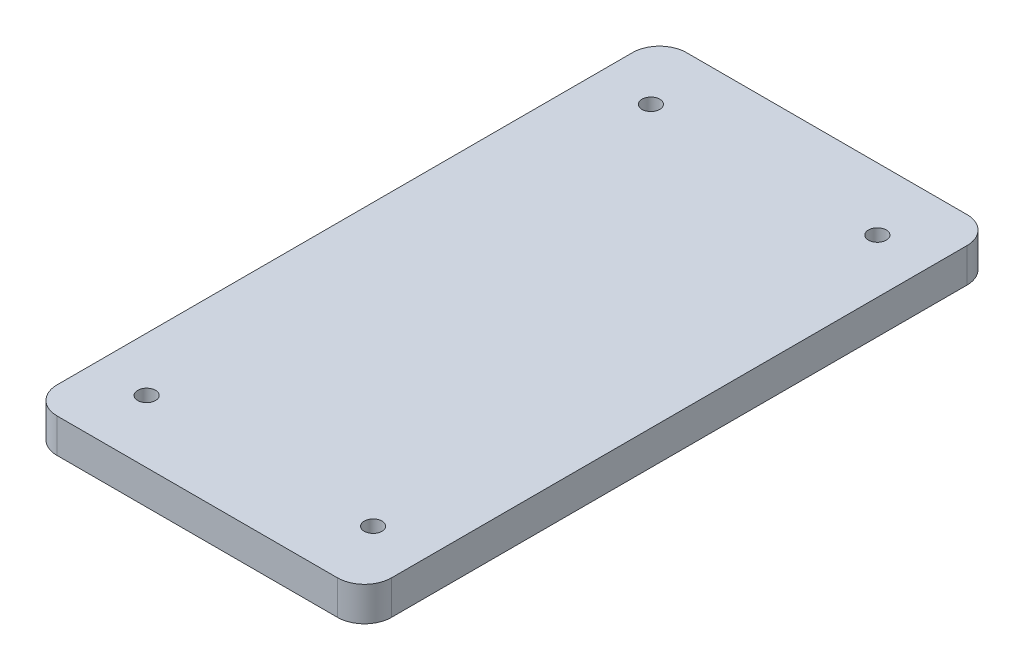
ISO-10303-21;
HEADER;
FILE_DESCRIPTION(('STEP AP214'),'2;1');
FILE_NAME('part.step','',(''),(''),'','','');
FILE_SCHEMA(('AUTOMOTIVE_DESIGN { 1 0 10303 214 1 1 1 1 }'));
ENDSEC;
DATA;
#1=APPLICATION_CONTEXT('core data for automotive mechanical design processes');
#2=APPLICATION_PROTOCOL_DEFINITION('international standard','automotive_design',2000,#1);
#3=PRODUCT_CONTEXT('',#1,'mechanical');
#4=PRODUCT('Part','Part','',(#3));
#5=PRODUCT_RELATED_PRODUCT_CATEGORY('part','',(#4));
#6=PRODUCT_DEFINITION_FORMATION('','',#4);
#7=PRODUCT_DEFINITION_CONTEXT('part definition',#1,'design');
#8=PRODUCT_DEFINITION('design','',#6,#7);
#9=PRODUCT_DEFINITION_SHAPE('','',#8);
#10=(LENGTH_UNIT() NAMED_UNIT(*) SI_UNIT(.MILLI.,.METRE.));
#11=(NAMED_UNIT(*) PLANE_ANGLE_UNIT() SI_UNIT($,.RADIAN.));
#12=(NAMED_UNIT(*) SI_UNIT($,.STERADIAN.) SOLID_ANGLE_UNIT());
#13=UNCERTAINTY_MEASURE_WITH_UNIT(LENGTH_MEASURE(1.E-05),#10,'distance_accuracy_value','');
#14=(GEOMETRIC_REPRESENTATION_CONTEXT(3) GLOBAL_UNCERTAINTY_ASSIGNED_CONTEXT((#13)) GLOBAL_UNIT_ASSIGNED_CONTEXT((#10,
#11,#12)) REPRESENTATION_CONTEXT('',''));
#15=CARTESIAN_POINT('',(0.,0.,0.));
#16=DIRECTION('',(0.,0.,1.));
#17=DIRECTION('',(1.,0.,0.));
#18=AXIS2_PLACEMENT_3D('',#15,#16,#17);
#19=CARTESIAN_POINT('',(0.,6.35,0.));
#20=DIRECTION('',(0.,-1.,0.));
#21=DIRECTION('',(0.,0.,-1.));
#22=AXIS2_PLACEMENT_3D('',#19,#20,#21);
#23=PLANE('',#22);
#24=DIRECTION('',(-1.,0.,0.));
#25=VECTOR('',#24,1.);
#26=CARTESIAN_POINT('',(0.,6.35,-116.7));
#27=LINE('',#26,#25);
#28=CARTESIAN_POINT('',(57.,6.35,-116.7));
#29=VERTEX_POINT('',#28);
#30=CARTESIAN_POINT('',(5.,6.35,-116.7));
#31=VERTEX_POINT('',#30);
#32=EDGE_CURVE('E154',#29,#31,#27,.T.);
#33=ORIENTED_EDGE('',*,*,#32,.T.);
#34=CARTESIAN_POINT('',(5.,6.35,-111.7));
#35=DIRECTION('',(0.,-1.,0.));
#36=DIRECTION('',(0.,0.,-1.));
#37=AXIS2_PLACEMENT_3D('',#34,#35,#36);
#38=CIRCLE('',#37,5.);
#39=CARTESIAN_POINT('',(0.,6.35,-111.7));
#40=VERTEX_POINT('',#39);
#41=EDGE_CURVE('E184',#31,#40,#38,.F.);
#42=ORIENTED_EDGE('',*,*,#41,.T.);
#43=DIRECTION('',(0.,0.,1.));
#44=VECTOR('',#43,1.);
#45=CARTESIAN_POINT('',(0.,6.35,0.));
#46=LINE('',#45,#44);
#47=CARTESIAN_POINT('',(0.,6.35,-5.));
#48=VERTEX_POINT('',#47);
#49=EDGE_CURVE('E133',#40,#48,#46,.T.);
#50=ORIENTED_EDGE('',*,*,#49,.T.);
#51=CARTESIAN_POINT('',(5.,6.35,-5.));
#52=DIRECTION('',(0.,-1.,0.));
#53=DIRECTION('',(0.,0.,-1.));
#54=AXIS2_PLACEMENT_3D('',#51,#52,#53);
#55=CIRCLE('',#54,5.);
#56=CARTESIAN_POINT('',(5.,6.35,0.));
#57=VERTEX_POINT('',#56);
#58=EDGE_CURVE('E176',#48,#57,#55,.F.);
#59=ORIENTED_EDGE('',*,*,#58,.T.);
#60=DIRECTION('',(1.,0.,0.));
#61=VECTOR('',#60,1.);
#62=CARTESIAN_POINT('',(0.,6.35,0.));
#63=LINE('',#62,#61);
#64=CARTESIAN_POINT('',(57.,6.35,0.));
#65=VERTEX_POINT('',#64);
#66=EDGE_CURVE('E199',#57,#65,#63,.T.);
#67=ORIENTED_EDGE('',*,*,#66,.T.);
#68=CARTESIAN_POINT('',(57.,6.35,-5.));
#69=DIRECTION('',(0.,-1.,0.));
#70=DIRECTION('',(0.,0.,-1.));
#71=AXIS2_PLACEMENT_3D('',#68,#69,#70);
#72=CIRCLE('',#71,5.);
#73=CARTESIAN_POINT('',(62.,6.35,-5.));
#74=VERTEX_POINT('',#73);
#75=EDGE_CURVE('E68',#65,#74,#72,.F.);
#76=ORIENTED_EDGE('',*,*,#75,.T.);
#77=DIRECTION('',(0.,0.,-1.));
#78=VECTOR('',#77,1.);
#79=CARTESIAN_POINT('',(62.,6.35,0.));
#80=LINE('',#79,#78);
#81=CARTESIAN_POINT('',(62.,6.35,-111.7));
#82=VERTEX_POINT('',#81);
#83=EDGE_CURVE('E207',#74,#82,#80,.T.);
#84=ORIENTED_EDGE('',*,*,#83,.T.);
#85=CARTESIAN_POINT('',(57.,6.35,-111.7));
#86=DIRECTION('',(0.,-1.,0.));
#87=DIRECTION('',(0.,0.,-1.));
#88=AXIS2_PLACEMENT_3D('',#85,#86,#87);
#89=CIRCLE('',#88,5.);
#90=EDGE_CURVE('E181',#82,#29,#89,.F.);
#91=ORIENTED_EDGE('',*,*,#90,.T.);
#92=EDGE_LOOP('',(#33,#42,#50,#59,#67,#76,#84,#91));
#93=FACE_BOUND('',#92,.T.);
#94=CARTESIAN_POINT('',(10.,6.35,-11.6));
#95=DIRECTION('',(0.,1.,0.));
#96=DIRECTION('',(0.,0.,1.));
#97=AXIS2_PLACEMENT_3D('',#94,#95,#96);
#98=CIRCLE('',#97,1.64999999999996);
#99=CARTESIAN_POINT('',(10.,6.35,-9.95000000000003));
#100=VERTEX_POINT('',#99);
#101=EDGE_CURVE('E143',#100,#100,#98,.T.);
#102=ORIENTED_EDGE('',*,*,#101,.F.);
#103=EDGE_LOOP('',(#102));
#104=FACE_BOUND('',#103,.T.);
#105=CARTESIAN_POINT('',(52.,6.35,-11.6));
#106=DIRECTION('',(0.,1.,0.));
#107=DIRECTION('',(0.,0.,1.));
#108=AXIS2_PLACEMENT_3D('',#105,#106,#107);
#109=CIRCLE('',#108,1.65);
#110=CARTESIAN_POINT('',(52.,6.35,-9.94999999999999));
#111=VERTEX_POINT('',#110);
#112=EDGE_CURVE('E219',#111,#111,#109,.T.);
#113=ORIENTED_EDGE('',*,*,#112,.F.);
#114=EDGE_LOOP('',(#113));
#115=FACE_BOUND('',#114,.T.);
#116=CARTESIAN_POINT('',(10.,6.35,-105.1));
#117=DIRECTION('',(0.,1.,0.));
#118=DIRECTION('',(0.,0.,-1.));
#119=AXIS2_PLACEMENT_3D('',#116,#117,#118);
#120=CIRCLE('',#119,1.64999999999995);
#121=CARTESIAN_POINT('',(10.,6.35,-106.75));
#122=VERTEX_POINT('',#121);
#123=EDGE_CURVE('E225',#122,#122,#120,.T.);
#124=ORIENTED_EDGE('',*,*,#123,.F.);
#125=EDGE_LOOP('',(#124));
#126=FACE_BOUND('',#125,.T.);
#127=CARTESIAN_POINT('',(52.,6.35,-105.1));
#128=DIRECTION('',(0.,1.,0.));
#129=DIRECTION('',(0.,0.,-1.));
#130=AXIS2_PLACEMENT_3D('',#127,#128,#129);
#131=CIRCLE('',#130,1.65);
#132=CARTESIAN_POINT('',(52.,6.35,-106.75));
#133=VERTEX_POINT('',#132);
#134=EDGE_CURVE('E233',#133,#133,#131,.T.);
#135=ORIENTED_EDGE('',*,*,#134,.F.);
#136=EDGE_LOOP('',(#135));
#137=FACE_BOUND('',#136,.T.);
#138=ADVANCED_FACE('F45',(#93,#104,#115,#126,#137),#23,.F.);
#139=CARTESIAN_POINT('',(0.,0.,0.));
#140=DIRECTION('',(0.,-1.,0.));
#141=DIRECTION('',(0.,0.,-1.));
#142=AXIS2_PLACEMENT_3D('',#139,#140,#141);
#143=PLANE('',#142);
#144=CARTESIAN_POINT('',(10.,0.,-105.1));
#145=DIRECTION('',(0.,1.,0.));
#146=DIRECTION('',(0.,0.,-1.));
#147=AXIS2_PLACEMENT_3D('',#144,#145,#146);
#148=CIRCLE('',#147,1.64999999999995);
#149=CARTESIAN_POINT('',(10.,0.,-106.75));
#150=VERTEX_POINT('',#149);
#151=EDGE_CURVE('E229',#150,#150,#148,.T.);
#152=ORIENTED_EDGE('',*,*,#151,.T.);
#153=EDGE_LOOP('',(#152));
#154=FACE_BOUND('',#153,.T.);
#155=CARTESIAN_POINT('',(10.,0.,-11.6));
#156=DIRECTION('',(0.,1.,0.));
#157=DIRECTION('',(0.,0.,1.));
#158=AXIS2_PLACEMENT_3D('',#155,#156,#157);
#159=CIRCLE('',#158,1.64999999999996);
#160=CARTESIAN_POINT('',(10.,0.,-9.95000000000003));
#161=VERTEX_POINT('',#160);
#162=EDGE_CURVE('E151',#161,#161,#159,.T.);
#163=ORIENTED_EDGE('',*,*,#162,.T.);
#164=EDGE_LOOP('',(#163));
#165=FACE_BOUND('',#164,.T.);
#166=DIRECTION('',(0.,0.,1.));
#167=VECTOR('',#166,1.);
#168=CARTESIAN_POINT('',(0.,0.,0.));
#169=LINE('',#168,#167);
#170=CARTESIAN_POINT('',(0.,0.,-111.7));
#171=VERTEX_POINT('',#170);
#172=CARTESIAN_POINT('',(0.,0.,-5.));
#173=VERTEX_POINT('',#172);
#174=EDGE_CURVE('E130',#171,#173,#169,.T.);
#175=ORIENTED_EDGE('',*,*,#174,.F.);
#176=CARTESIAN_POINT('',(5.,0.,-111.7));
#177=DIRECTION('',(0.,-1.,0.));
#178=DIRECTION('',(0.,0.,-1.));
#179=AXIS2_PLACEMENT_3D('',#176,#177,#178);
#180=CIRCLE('',#179,5.);
#181=CARTESIAN_POINT('',(5.,0.,-116.7));
#182=VERTEX_POINT('',#181);
#183=EDGE_CURVE('E112',#171,#182,#180,.T.);
#184=ORIENTED_EDGE('',*,*,#183,.T.);
#185=DIRECTION('',(-1.,0.,0.));
#186=VECTOR('',#185,1.);
#187=CARTESIAN_POINT('',(0.,0.,-116.7));
#188=LINE('',#187,#186);
#189=CARTESIAN_POINT('',(57.,0.,-116.7));
#190=VERTEX_POINT('',#189);
#191=EDGE_CURVE('E159',#190,#182,#188,.T.);
#192=ORIENTED_EDGE('',*,*,#191,.F.);
#193=CARTESIAN_POINT('',(57.,0.,-111.7));
#194=DIRECTION('',(0.,-1.,0.));
#195=DIRECTION('',(0.,0.,-1.));
#196=AXIS2_PLACEMENT_3D('',#193,#194,#195);
#197=CIRCLE('',#196,5.);
#198=CARTESIAN_POINT('',(62.,0.,-111.7));
#199=VERTEX_POINT('',#198);
#200=EDGE_CURVE('E124',#190,#199,#197,.T.);
#201=ORIENTED_EDGE('',*,*,#200,.T.);
#202=DIRECTION('',(0.,0.,-1.));
#203=VECTOR('',#202,1.);
#204=CARTESIAN_POINT('',(62.,0.,0.));
#205=LINE('',#204,#203);
#206=CARTESIAN_POINT('',(62.,0.,-5.));
#207=VERTEX_POINT('',#206);
#208=EDGE_CURVE('E148',#207,#199,#205,.T.);
#209=ORIENTED_EDGE('',*,*,#208,.F.);
#210=CARTESIAN_POINT('',(57.,0.,-5.));
#211=DIRECTION('',(0.,-1.,0.));
#212=DIRECTION('',(0.,0.,-1.));
#213=AXIS2_PLACEMENT_3D('',#210,#211,#212);
#214=CIRCLE('',#213,5.);
#215=CARTESIAN_POINT('',(57.,0.,0.));
#216=VERTEX_POINT('',#215);
#217=EDGE_CURVE('E166',#207,#216,#214,.T.);
#218=ORIENTED_EDGE('',*,*,#217,.T.);
#219=DIRECTION('',(1.,0.,0.));
#220=VECTOR('',#219,1.);
#221=CARTESIAN_POINT('',(0.,0.,0.));
#222=LINE('',#221,#220);
#223=CARTESIAN_POINT('',(5.,0.,0.));
#224=VERTEX_POINT('',#223);
#225=EDGE_CURVE('E142',#224,#216,#222,.T.);
#226=ORIENTED_EDGE('',*,*,#225,.F.);
#227=CARTESIAN_POINT('',(5.,0.,-5.));
#228=DIRECTION('',(0.,-1.,0.));
#229=DIRECTION('',(0.,0.,-1.));
#230=AXIS2_PLACEMENT_3D('',#227,#228,#229);
#231=CIRCLE('',#230,5.);
#232=EDGE_CURVE('E135',#224,#173,#231,.T.);
#233=ORIENTED_EDGE('',*,*,#232,.T.);
#234=EDGE_LOOP('',(#175,#184,#192,#201,#209,#218,#226,#233));
#235=FACE_BOUND('',#234,.T.);
#236=CARTESIAN_POINT('',(52.,0.,-11.6));
#237=DIRECTION('',(0.,1.,0.));
#238=DIRECTION('',(0.,0.,1.));
#239=AXIS2_PLACEMENT_3D('',#236,#237,#238);
#240=CIRCLE('',#239,1.65);
#241=CARTESIAN_POINT('',(52.,0.,-9.94999999999999));
#242=VERTEX_POINT('',#241);
#243=EDGE_CURVE('E221',#242,#242,#240,.T.);
#244=ORIENTED_EDGE('',*,*,#243,.T.);
#245=EDGE_LOOP('',(#244));
#246=FACE_BOUND('',#245,.T.);
#247=CARTESIAN_POINT('',(52.,0.,-105.1));
#248=DIRECTION('',(0.,1.,0.));
#249=DIRECTION('',(0.,0.,-1.));
#250=AXIS2_PLACEMENT_3D('',#247,#248,#249);
#251=CIRCLE('',#250,1.65);
#252=CARTESIAN_POINT('',(52.,0.,-106.75));
#253=VERTEX_POINT('',#252);
#254=EDGE_CURVE('E237',#253,#253,#251,.T.);
#255=ORIENTED_EDGE('',*,*,#254,.T.);
#256=EDGE_LOOP('',(#255));
#257=FACE_BOUND('',#256,.T.);
#258=ADVANCED_FACE('F138',(#154,#165,#235,#246,#257),#143,.T.);
#259=CARTESIAN_POINT('',(0.,6.35,0.));
#260=DIRECTION('',(1.,0.,0.));
#261=DIRECTION('',(0.,0.,-1.));
#262=AXIS2_PLACEMENT_3D('',#259,#260,#261);
#263=PLANE('',#262);
#264=ORIENTED_EDGE('',*,*,#49,.F.);
#265=DIRECTION('',(0.,-1.,0.));
#266=VECTOR('',#265,1.);
#267=CARTESIAN_POINT('',(0.,6.35,-111.7));
#268=LINE('',#267,#266);
#269=EDGE_CURVE('E116',#40,#171,#268,.T.);
#270=ORIENTED_EDGE('',*,*,#269,.T.);
#271=ORIENTED_EDGE('',*,*,#174,.T.);
#272=DIRECTION('',(0.,-1.,0.));
#273=VECTOR('',#272,1.);
#274=CARTESIAN_POINT('',(0.,6.35,-5.));
#275=LINE('',#274,#273);
#276=EDGE_CURVE('E136',#173,#48,#275,.F.);
#277=ORIENTED_EDGE('',*,*,#276,.T.);
#278=EDGE_LOOP('',(#264,#270,#271,#277));
#279=FACE_BOUND('',#278,.T.);
#280=ADVANCED_FACE('F129',(#279),#263,.F.);
#281=CARTESIAN_POINT('',(0.,6.35,0.));
#282=DIRECTION('',(0.,0.,-1.));
#283=DIRECTION('',(-1.,0.,0.));
#284=AXIS2_PLACEMENT_3D('',#281,#282,#283);
#285=PLANE('',#284);
#286=ORIENTED_EDGE('',*,*,#225,.T.);
#287=DIRECTION('',(0.,-1.,0.));
#288=VECTOR('',#287,1.);
#289=CARTESIAN_POINT('',(57.,6.35,0.));
#290=LINE('',#289,#288);
#291=EDGE_CURVE('E11',#216,#65,#290,.F.);
#292=ORIENTED_EDGE('',*,*,#291,.T.);
#293=ORIENTED_EDGE('',*,*,#66,.F.);
#294=DIRECTION('',(0.,-1.,0.));
#295=VECTOR('',#294,1.);
#296=CARTESIAN_POINT('',(5.,6.35,0.));
#297=LINE('',#296,#295);
#298=EDGE_CURVE('E54',#57,#224,#297,.T.);
#299=ORIENTED_EDGE('',*,*,#298,.T.);
#300=EDGE_LOOP('',(#286,#292,#293,#299));
#301=FACE_BOUND('',#300,.T.);
#302=ADVANCED_FACE('F197',(#301),#285,.F.);
#303=CARTESIAN_POINT('',(62.,6.35,0.));
#304=DIRECTION('',(-1.,0.,0.));
#305=DIRECTION('',(0.,0.,1.));
#306=AXIS2_PLACEMENT_3D('',#303,#304,#305);
#307=PLANE('',#306);
#308=ORIENTED_EDGE('',*,*,#208,.T.);
#309=DIRECTION('',(0.,-1.,0.));
#310=VECTOR('',#309,1.);
#311=CARTESIAN_POINT('',(62.,6.35,-111.7));
#312=LINE('',#311,#310);
#313=EDGE_CURVE('E61',#199,#82,#312,.F.);
#314=ORIENTED_EDGE('',*,*,#313,.T.);
#315=ORIENTED_EDGE('',*,*,#83,.F.);
#316=DIRECTION('',(0.,-1.,0.));
#317=VECTOR('',#316,1.);
#318=CARTESIAN_POINT('',(62.,6.35,-5.));
#319=LINE('',#318,#317);
#320=EDGE_CURVE('E187',#74,#207,#319,.T.);
#321=ORIENTED_EDGE('',*,*,#320,.T.);
#322=EDGE_LOOP('',(#308,#314,#315,#321));
#323=FACE_BOUND('',#322,.T.);
#324=ADVANCED_FACE('F206',(#323),#307,.F.);
#325=CARTESIAN_POINT('',(0.,6.35,-116.7));
#326=DIRECTION('',(0.,0.,1.));
#327=DIRECTION('',(1.,0.,0.));
#328=AXIS2_PLACEMENT_3D('',#325,#326,#327);
#329=PLANE('',#328);
#330=ORIENTED_EDGE('',*,*,#191,.T.);
#331=DIRECTION('',(0.,-1.,0.));
#332=VECTOR('',#331,1.);
#333=CARTESIAN_POINT('',(5.,6.35,-116.7));
#334=LINE('',#333,#332);
#335=EDGE_CURVE('E117',#182,#31,#334,.F.);
#336=ORIENTED_EDGE('',*,*,#335,.T.);
#337=ORIENTED_EDGE('',*,*,#32,.F.);
#338=DIRECTION('',(0.,-1.,0.));
#339=VECTOR('',#338,1.);
#340=CARTESIAN_POINT('',(57.,6.35,-116.7));
#341=LINE('',#340,#339);
#342=EDGE_CURVE('E123',#29,#190,#341,.T.);
#343=ORIENTED_EDGE('',*,*,#342,.T.);
#344=EDGE_LOOP('',(#330,#336,#337,#343));
#345=FACE_BOUND('',#344,.T.);
#346=ADVANCED_FACE('F261',(#345),#329,.F.);
#347=CARTESIAN_POINT('',(10.,6.35,-11.6));
#348=DIRECTION('',(0.,-1.,0.));
#349=DIRECTION('',(0.,0.,-1.));
#350=AXIS2_PLACEMENT_3D('',#347,#348,#349);
#351=CYLINDRICAL_SURFACE('',#350,1.64999999999996);
#352=ORIENTED_EDGE('',*,*,#101,.T.);
#353=EDGE_LOOP('',(#352));
#354=FACE_BOUND('',#353,.T.);
#355=ORIENTED_EDGE('',*,*,#162,.F.);
#356=EDGE_LOOP('',(#355));
#357=FACE_BOUND('',#356,.T.);
#358=ADVANCED_FACE('F258',(#354,#357),#351,.F.);
#359=CARTESIAN_POINT('',(52.,6.35,-11.6));
#360=DIRECTION('',(0.,-1.,0.));
#361=DIRECTION('',(0.,0.,-1.));
#362=AXIS2_PLACEMENT_3D('',#359,#360,#361);
#363=CYLINDRICAL_SURFACE('',#362,1.65);
#364=ORIENTED_EDGE('',*,*,#112,.T.);
#365=EDGE_LOOP('',(#364));
#366=FACE_BOUND('',#365,.T.);
#367=ORIENTED_EDGE('',*,*,#243,.F.);
#368=EDGE_LOOP('',(#367));
#369=FACE_BOUND('',#368,.T.);
#370=ADVANCED_FACE('F318',(#366,#369),#363,.F.);
#371=CARTESIAN_POINT('',(10.,6.35,-105.1));
#372=DIRECTION('',(0.,-1.,0.));
#373=DIRECTION('',(0.,0.,-1.));
#374=AXIS2_PLACEMENT_3D('',#371,#372,#373);
#375=CYLINDRICAL_SURFACE('',#374,1.64999999999995);
#376=ORIENTED_EDGE('',*,*,#123,.T.);
#377=EDGE_LOOP('',(#376));
#378=FACE_BOUND('',#377,.T.);
#379=ORIENTED_EDGE('',*,*,#151,.F.);
#380=EDGE_LOOP('',(#379));
#381=FACE_BOUND('',#380,.T.);
#382=ADVANCED_FACE('F309',(#378,#381),#375,.F.);
#383=CARTESIAN_POINT('',(52.,6.35,-105.1));
#384=DIRECTION('',(0.,-1.,0.));
#385=DIRECTION('',(0.,0.,-1.));
#386=AXIS2_PLACEMENT_3D('',#383,#384,#385);
#387=CYLINDRICAL_SURFACE('',#386,1.65);
#388=ORIENTED_EDGE('',*,*,#134,.T.);
#389=EDGE_LOOP('',(#388));
#390=FACE_BOUND('',#389,.T.);
#391=ORIENTED_EDGE('',*,*,#254,.F.);
#392=EDGE_LOOP('',(#391));
#393=FACE_BOUND('',#392,.T.);
#394=ADVANCED_FACE('F245',(#390,#393),#387,.F.);
#395=CARTESIAN_POINT('',(5.,6.35,-111.7));
#396=DIRECTION('',(0.,-1.,0.));
#397=DIRECTION('',(0.,0.,-1.));
#398=AXIS2_PLACEMENT_3D('',#395,#396,#397);
#399=CYLINDRICAL_SURFACE('',#398,5.);
#400=ORIENTED_EDGE('',*,*,#41,.F.);
#401=ORIENTED_EDGE('',*,*,#335,.F.);
#402=ORIENTED_EDGE('',*,*,#183,.F.);
#403=ORIENTED_EDGE('',*,*,#269,.F.);
#404=EDGE_LOOP('',(#400,#401,#402,#403));
#405=FACE_BOUND('',#404,.T.);
#406=ADVANCED_FACE('F115',(#405),#399,.T.);
#407=CARTESIAN_POINT('',(57.,6.35,-111.7));
#408=DIRECTION('',(0.,-1.,0.));
#409=DIRECTION('',(0.,0.,-1.));
#410=AXIS2_PLACEMENT_3D('',#407,#408,#409);
#411=CYLINDRICAL_SURFACE('',#410,5.);
#412=ORIENTED_EDGE('',*,*,#90,.F.);
#413=ORIENTED_EDGE('',*,*,#313,.F.);
#414=ORIENTED_EDGE('',*,*,#200,.F.);
#415=ORIENTED_EDGE('',*,*,#342,.F.);
#416=EDGE_LOOP('',(#412,#413,#414,#415));
#417=FACE_BOUND('',#416,.T.);
#418=ADVANCED_FACE('F273',(#417),#411,.T.);
#419=CARTESIAN_POINT('',(57.,6.35,-5.));
#420=DIRECTION('',(0.,-1.,0.));
#421=DIRECTION('',(0.,0.,-1.));
#422=AXIS2_PLACEMENT_3D('',#419,#420,#421);
#423=CYLINDRICAL_SURFACE('',#422,5.);
#424=ORIENTED_EDGE('',*,*,#75,.F.);
#425=ORIENTED_EDGE('',*,*,#291,.F.);
#426=ORIENTED_EDGE('',*,*,#217,.F.);
#427=ORIENTED_EDGE('',*,*,#320,.F.);
#428=EDGE_LOOP('',(#424,#425,#426,#427));
#429=FACE_BOUND('',#428,.T.);
#430=ADVANCED_FACE('F205',(#429),#423,.T.);
#431=CARTESIAN_POINT('',(5.,6.35,-5.));
#432=DIRECTION('',(0.,-1.,0.));
#433=DIRECTION('',(0.,0.,-1.));
#434=AXIS2_PLACEMENT_3D('',#431,#432,#433);
#435=CYLINDRICAL_SURFACE('',#434,5.);
#436=ORIENTED_EDGE('',*,*,#58,.F.);
#437=ORIENTED_EDGE('',*,*,#276,.F.);
#438=ORIENTED_EDGE('',*,*,#232,.F.);
#439=ORIENTED_EDGE('',*,*,#298,.F.);
#440=EDGE_LOOP('',(#436,#437,#438,#439));
#441=FACE_BOUND('',#440,.T.);
#442=ADVANCED_FACE('F47',(#441),#435,.T.);
#443=CLOSED_SHELL('',(#138,#258,#280,#302,#324,#346,#358,#370,#382,#394,#406,#418,#430,#442));
#444=MANIFOLD_SOLID_BREP('B2',#443);
#445=ADVANCED_BREP_SHAPE_REPRESENTATION('',(#18,#444),#14);
#446=SHAPE_DEFINITION_REPRESENTATION(#9,#445);
ENDSEC;
END-ISO-10303-21;
